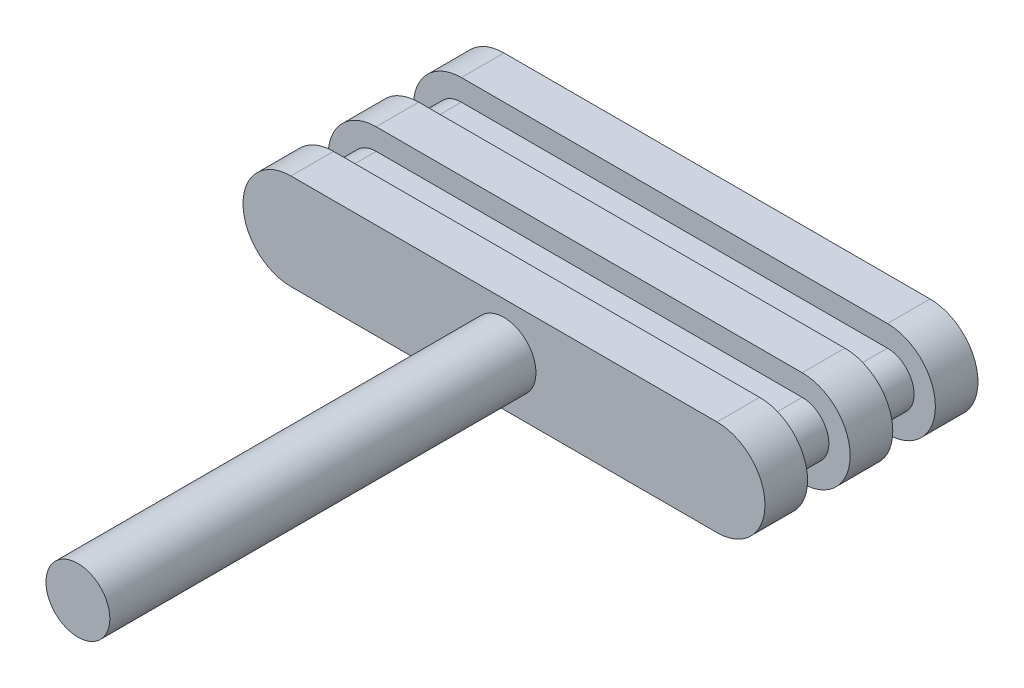
ISO-10303-21;
HEADER;
FILE_DESCRIPTION(('STEP AP214'),'2;1');
FILE_NAME('part.step','',(''),(''),'','','');
FILE_SCHEMA(('AUTOMOTIVE_DESIGN { 1 0 10303 214 1 1 1 1 }'));
ENDSEC;
DATA;
#1=APPLICATION_CONTEXT('core data for automotive mechanical design processes');
#2=APPLICATION_PROTOCOL_DEFINITION('international standard','automotive_design',2000,#1);
#3=PRODUCT_CONTEXT('',#1,'mechanical');
#4=PRODUCT('Part','Part','',(#3));
#5=PRODUCT_RELATED_PRODUCT_CATEGORY('part','',(#4));
#6=PRODUCT_DEFINITION_FORMATION('','',#4);
#7=PRODUCT_DEFINITION_CONTEXT('part definition',#1,'design');
#8=PRODUCT_DEFINITION('design','',#6,#7);
#9=PRODUCT_DEFINITION_SHAPE('','',#8);
#10=(LENGTH_UNIT() NAMED_UNIT(*) SI_UNIT(.MILLI.,.METRE.));
#11=(NAMED_UNIT(*) PLANE_ANGLE_UNIT() SI_UNIT($,.RADIAN.));
#12=(NAMED_UNIT(*) SI_UNIT($,.STERADIAN.) SOLID_ANGLE_UNIT());
#13=UNCERTAINTY_MEASURE_WITH_UNIT(LENGTH_MEASURE(1.E-05),#10,'distance_accuracy_value','');
#14=(GEOMETRIC_REPRESENTATION_CONTEXT(3) GLOBAL_UNCERTAINTY_ASSIGNED_CONTEXT((#13)) GLOBAL_UNIT_ASSIGNED_CONTEXT((#10,
#11,#12)) REPRESENTATION_CONTEXT('',''));
#15=CARTESIAN_POINT('',(0.,0.,0.));
#16=DIRECTION('',(0.,0.,1.));
#17=DIRECTION('',(1.,0.,0.));
#18=AXIS2_PLACEMENT_3D('',#15,#16,#17);
#19=CARTESIAN_POINT('',(0.,-2.25,5.));
#20=DIRECTION('',(0.,1.,0.));
#21=DIRECTION('',(0.,0.,1.));
#22=AXIS2_PLACEMENT_3D('',#19,#20,#21);
#23=PLANE('',#22);
#24=DIRECTION('',(0.,0.,-1.));
#25=VECTOR('',#24,1.);
#26=CARTESIAN_POINT('',(-10.,-2.25,5.));
#27=LINE('',#26,#25);
#28=CARTESIAN_POINT('',(-10.,-2.25,5.));
#29=VERTEX_POINT('',#28);
#30=CARTESIAN_POINT('',(-10.,-2.25,3.));
#31=VERTEX_POINT('',#30);
#32=EDGE_CURVE('E326',#29,#31,#27,.T.);
#33=ORIENTED_EDGE('',*,*,#32,.T.);
#34=DIRECTION('',(1.,0.,0.));
#35=VECTOR('',#34,1.);
#36=CARTESIAN_POINT('',(0.,-2.25,3.));
#37=LINE('',#36,#35);
#38=CARTESIAN_POINT('',(10.,-2.25,3.));
#39=VERTEX_POINT('',#38);
#40=EDGE_CURVE('E294',#31,#39,#37,.T.);
#41=ORIENTED_EDGE('',*,*,#40,.T.);
#42=DIRECTION('',(0.,0.,-1.));
#43=VECTOR('',#42,1.);
#44=CARTESIAN_POINT('',(10.,-2.25,5.));
#45=LINE('',#44,#43);
#46=CARTESIAN_POINT('',(10.,-2.25,5.));
#47=VERTEX_POINT('',#46);
#48=EDGE_CURVE('E13',#47,#39,#45,.T.);
#49=ORIENTED_EDGE('',*,*,#48,.F.);
#50=DIRECTION('',(1.,0.,0.));
#51=VECTOR('',#50,1.);
#52=CARTESIAN_POINT('',(0.,-2.25,5.));
#53=LINE('',#52,#51);
#54=EDGE_CURVE('E305',#29,#47,#53,.T.);
#55=ORIENTED_EDGE('',*,*,#54,.F.);
#56=EDGE_LOOP('',(#33,#41,#49,#55));
#57=FACE_BOUND('',#56,.T.);
#58=ADVANCED_FACE('F51',(#57),#23,.F.);
#59=CARTESIAN_POINT('',(10.,0.,5.));
#60=DIRECTION('',(0.,0.,-1.));
#61=DIRECTION('',(-1.,0.,0.));
#62=AXIS2_PLACEMENT_3D('',#59,#60,#61);
#63=CYLINDRICAL_SURFACE('',#62,2.25);
#64=ORIENTED_EDGE('',*,*,#48,.T.);
#65=CARTESIAN_POINT('',(10.,0.,3.));
#66=DIRECTION('',(0.,0.,1.));
#67=DIRECTION('',(1.,0.,0.));
#68=AXIS2_PLACEMENT_3D('',#65,#66,#67);
#69=CIRCLE('',#68,2.25);
#70=CARTESIAN_POINT('',(10.,2.25,3.));
#71=VERTEX_POINT('',#70);
#72=EDGE_CURVE('E282',#39,#71,#69,.T.);
#73=ORIENTED_EDGE('',*,*,#72,.T.);
#74=DIRECTION('',(0.,0.,-1.));
#75=VECTOR('',#74,1.);
#76=CARTESIAN_POINT('',(10.,2.25,5.));
#77=LINE('',#76,#75);
#78=CARTESIAN_POINT('',(10.,2.25,5.));
#79=VERTEX_POINT('',#78);
#80=EDGE_CURVE('E335',#79,#71,#77,.T.);
#81=ORIENTED_EDGE('',*,*,#80,.F.);
#82=CARTESIAN_POINT('',(10.,0.,5.));
#83=DIRECTION('',(0.,0.,1.));
#84=DIRECTION('',(1.,0.,0.));
#85=AXIS2_PLACEMENT_3D('',#82,#83,#84);
#86=CIRCLE('',#85,2.25);
#87=EDGE_CURVE('E308',#47,#79,#86,.T.);
#88=ORIENTED_EDGE('',*,*,#87,.F.);
#89=EDGE_LOOP('',(#64,#73,#81,#88));
#90=FACE_BOUND('',#89,.T.);
#91=ADVANCED_FACE('F393',(#90),#63,.T.);
#92=CARTESIAN_POINT('',(0.,2.25,5.));
#93=DIRECTION('',(0.,-1.,0.));
#94=DIRECTION('',(0.,0.,-1.));
#95=AXIS2_PLACEMENT_3D('',#92,#93,#94);
#96=PLANE('',#95);
#97=ORIENTED_EDGE('',*,*,#80,.T.);
#98=DIRECTION('',(-1.,0.,0.));
#99=VECTOR('',#98,1.);
#100=CARTESIAN_POINT('',(0.,2.25,3.));
#101=LINE('',#100,#99);
#102=CARTESIAN_POINT('',(-10.,2.25,3.));
#103=VERTEX_POINT('',#102);
#104=EDGE_CURVE('E273',#71,#103,#101,.T.);
#105=ORIENTED_EDGE('',*,*,#104,.T.);
#106=DIRECTION('',(0.,0.,-1.));
#107=VECTOR('',#106,1.);
#108=CARTESIAN_POINT('',(-10.,2.25,5.));
#109=LINE('',#108,#107);
#110=CARTESIAN_POINT('',(-10.,2.25,5.));
#111=VERTEX_POINT('',#110);
#112=EDGE_CURVE('E331',#111,#103,#109,.T.);
#113=ORIENTED_EDGE('',*,*,#112,.F.);
#114=DIRECTION('',(-1.,0.,0.));
#115=VECTOR('',#114,1.);
#116=CARTESIAN_POINT('',(0.,2.25,5.));
#117=LINE('',#116,#115);
#118=EDGE_CURVE('E311',#79,#111,#117,.T.);
#119=ORIENTED_EDGE('',*,*,#118,.F.);
#120=EDGE_LOOP('',(#97,#105,#113,#119));
#121=FACE_BOUND('',#120,.T.);
#122=ADVANCED_FACE('F398',(#121),#96,.F.);
#123=CARTESIAN_POINT('',(-10.,0.,5.));
#124=DIRECTION('',(0.,0.,-1.));
#125=DIRECTION('',(-1.,0.,0.));
#126=AXIS2_PLACEMENT_3D('',#123,#124,#125);
#127=CYLINDRICAL_SURFACE('',#126,2.25);
#128=ORIENTED_EDGE('',*,*,#112,.T.);
#129=CARTESIAN_POINT('',(-10.,0.,3.));
#130=DIRECTION('',(0.,0.,1.));
#131=DIRECTION('',(1.,0.,0.));
#132=AXIS2_PLACEMENT_3D('',#129,#130,#131);
#133=CIRCLE('',#132,2.25);
#134=EDGE_CURVE('E291',#103,#31,#133,.T.);
#135=ORIENTED_EDGE('',*,*,#134,.T.);
#136=ORIENTED_EDGE('',*,*,#32,.F.);
#137=CARTESIAN_POINT('',(-10.,0.,5.));
#138=DIRECTION('',(0.,0.,1.));
#139=DIRECTION('',(1.,0.,0.));
#140=AXIS2_PLACEMENT_3D('',#137,#138,#139);
#141=CIRCLE('',#140,2.25);
#142=EDGE_CURVE('E313',#111,#29,#141,.T.);
#143=ORIENTED_EDGE('',*,*,#142,.F.);
#144=EDGE_LOOP('',(#128,#135,#136,#143));
#145=FACE_BOUND('',#144,.T.);
#146=ADVANCED_FACE('F415',(#145),#127,.T.);
#147=CARTESIAN_POINT('',(0.,0.,5.));
#148=DIRECTION('',(0.,0.,1.));
#149=DIRECTION('',(1.,0.,0.));
#150=AXIS2_PLACEMENT_3D('',#147,#148,#149);
#151=PLANE('',#150);
#152=CARTESIAN_POINT('',(0.,0.,5.));
#153=DIRECTION('',(0.,0.,1.));
#154=DIRECTION('',(1.,0.,0.));
#155=AXIS2_PLACEMENT_3D('',#152,#153,#154);
#156=CIRCLE('',#155,1.5);
#157=CARTESIAN_POINT('',(1.5,0.,5.));
#158=VERTEX_POINT('',#157);
#159=EDGE_CURVE('E288',#158,#158,#156,.T.);
#160=ORIENTED_EDGE('',*,*,#159,.F.);
#161=EDGE_LOOP('',(#160));
#162=FACE_BOUND('',#161,.T.);
#163=ORIENTED_EDGE('',*,*,#54,.T.);
#164=ORIENTED_EDGE('',*,*,#87,.T.);
#165=ORIENTED_EDGE('',*,*,#118,.T.);
#166=ORIENTED_EDGE('',*,*,#142,.T.);
#167=EDGE_LOOP('',(#163,#164,#165,#166));
#168=FACE_BOUND('',#167,.T.);
#169=ADVANCED_FACE('F413',(#162,#168),#151,.T.);
#170=CARTESIAN_POINT('',(0.,0.,25.));
#171=DIRECTION('',(0.,0.,-1.));
#172=DIRECTION('',(-1.,0.,0.));
#173=AXIS2_PLACEMENT_3D('',#170,#171,#172);
#174=CYLINDRICAL_SURFACE('',#173,1.5);
#175=CARTESIAN_POINT('',(0.,0.,25.));
#176=DIRECTION('',(0.,0.,1.));
#177=DIRECTION('',(1.,0.,0.));
#178=AXIS2_PLACEMENT_3D('',#175,#176,#177);
#179=CIRCLE('',#178,1.5);
#180=CARTESIAN_POINT('',(1.5,0.,25.));
#181=VERTEX_POINT('',#180);
#182=EDGE_CURVE('E299',#181,#181,#179,.T.);
#183=ORIENTED_EDGE('',*,*,#182,.F.);
#184=EDGE_LOOP('',(#183));
#185=FACE_BOUND('',#184,.T.);
#186=ORIENTED_EDGE('',*,*,#159,.T.);
#187=EDGE_LOOP('',(#186));
#188=FACE_BOUND('',#187,.T.);
#189=ADVANCED_FACE('F571',(#185,#188),#174,.T.);
#190=CARTESIAN_POINT('',(0.,0.,25.));
#191=DIRECTION('',(0.,0.,1.));
#192=DIRECTION('',(1.,0.,0.));
#193=AXIS2_PLACEMENT_3D('',#190,#191,#192);
#194=PLANE('',#193);
#195=ORIENTED_EDGE('',*,*,#182,.T.);
#196=EDGE_LOOP('',(#195));
#197=FACE_BOUND('',#196,.T.);
#198=ADVANCED_FACE('F561',(#197),#194,.T.);
#199=CARTESIAN_POINT('',(-10.,0.,1.));
#200=DIRECTION('',(0.,0.,1.));
#201=DIRECTION('',(1.,0.,0.));
#202=AXIS2_PLACEMENT_3D('',#199,#200,#201);
#203=PLANE('',#202);
#204=DIRECTION('',(1.,0.,0.));
#205=VECTOR('',#204,1.);
#206=CARTESIAN_POINT('',(-10.,-1.25,1.));
#207=LINE('',#206,#205);
#208=CARTESIAN_POINT('',(-10.,-1.25,1.));
#209=VERTEX_POINT('',#208);
#210=CARTESIAN_POINT('',(10.,-1.25,1.));
#211=VERTEX_POINT('',#210);
#212=EDGE_CURVE('E254',#209,#211,#207,.T.);
#213=ORIENTED_EDGE('',*,*,#212,.F.);
#214=CARTESIAN_POINT('',(-10.,0.,1.));
#215=DIRECTION('',(0.,0.,1.));
#216=DIRECTION('',(1.,0.,0.));
#217=AXIS2_PLACEMENT_3D('',#214,#215,#216);
#218=CIRCLE('',#217,1.25);
#219=CARTESIAN_POINT('',(-10.,1.25,1.));
#220=VERTEX_POINT('',#219);
#221=EDGE_CURVE('E250',#220,#209,#218,.T.);
#222=ORIENTED_EDGE('',*,*,#221,.F.);
#223=DIRECTION('',(-1.,0.,0.));
#224=VECTOR('',#223,1.);
#225=CARTESIAN_POINT('',(10.,1.25,1.));
#226=LINE('',#225,#224);
#227=CARTESIAN_POINT('',(10.,1.25,1.));
#228=VERTEX_POINT('',#227);
#229=EDGE_CURVE('E247',#228,#220,#226,.T.);
#230=ORIENTED_EDGE('',*,*,#229,.F.);
#231=CARTESIAN_POINT('',(10.,0.,1.));
#232=DIRECTION('',(0.,0.,1.));
#233=DIRECTION('',(1.,0.,0.));
#234=AXIS2_PLACEMENT_3D('',#231,#232,#233);
#235=CIRCLE('',#234,1.25);
#236=EDGE_CURVE('E257',#211,#228,#235,.T.);
#237=ORIENTED_EDGE('',*,*,#236,.F.);
#238=EDGE_LOOP('',(#213,#222,#230,#237));
#239=FACE_BOUND('',#238,.T.);
#240=DIRECTION('',(-1.,0.,0.));
#241=VECTOR('',#240,1.);
#242=CARTESIAN_POINT('',(10.,2.25,1.));
#243=LINE('',#242,#241);
#244=CARTESIAN_POINT('',(10.,2.25,1.));
#245=VERTEX_POINT('',#244);
#246=CARTESIAN_POINT('',(-10.,2.25,1.));
#247=VERTEX_POINT('',#246);
#248=EDGE_CURVE('E279',#245,#247,#243,.T.);
#249=ORIENTED_EDGE('',*,*,#248,.T.);
#250=CARTESIAN_POINT('',(-10.,0.,1.));
#251=DIRECTION('',(0.,0.,1.));
#252=DIRECTION('',(1.,0.,0.));
#253=AXIS2_PLACEMENT_3D('',#250,#251,#252);
#254=CIRCLE('',#253,2.25);
#255=CARTESIAN_POINT('',(-10.,-2.25,1.));
#256=VERTEX_POINT('',#255);
#257=EDGE_CURVE('E281',#247,#256,#254,.T.);
#258=ORIENTED_EDGE('',*,*,#257,.T.);
#259=DIRECTION('',(1.,0.,0.));
#260=VECTOR('',#259,1.);
#261=CARTESIAN_POINT('',(-10.,-2.25,1.));
#262=LINE('',#261,#260);
#263=CARTESIAN_POINT('',(10.,-2.25,1.));
#264=VERTEX_POINT('',#263);
#265=EDGE_CURVE('E284',#256,#264,#262,.T.);
#266=ORIENTED_EDGE('',*,*,#265,.T.);
#267=CARTESIAN_POINT('',(10.,0.,1.));
#268=DIRECTION('',(0.,0.,1.));
#269=DIRECTION('',(1.,0.,0.));
#270=AXIS2_PLACEMENT_3D('',#267,#268,#269);
#271=CIRCLE('',#270,2.25);
#272=EDGE_CURVE('E286',#264,#245,#271,.T.);
#273=ORIENTED_EDGE('',*,*,#272,.T.);
#274=EDGE_LOOP('',(#249,#258,#266,#273));
#275=FACE_BOUND('',#274,.T.);
#276=ADVANCED_FACE('F552',(#239,#275),#203,.T.);
#277=CARTESIAN_POINT('',(-10.,0.,3.));
#278=DIRECTION('',(0.,0.,1.));
#279=DIRECTION('',(1.,0.,0.));
#280=AXIS2_PLACEMENT_3D('',#277,#278,#279);
#281=PLANE('',#280);
#282=CARTESIAN_POINT('',(10.,0.,3.));
#283=DIRECTION('',(0.,0.,1.));
#284=DIRECTION('',(1.,0.,0.));
#285=AXIS2_PLACEMENT_3D('',#282,#283,#284);
#286=CIRCLE('',#285,1.25);
#287=CARTESIAN_POINT('',(10.,-1.25,3.));
#288=VERTEX_POINT('',#287);
#289=CARTESIAN_POINT('',(10.,1.25,3.));
#290=VERTEX_POINT('',#289);
#291=EDGE_CURVE('E251',#288,#290,#286,.T.);
#292=ORIENTED_EDGE('',*,*,#291,.T.);
#293=DIRECTION('',(-1.,0.,0.));
#294=VECTOR('',#293,1.);
#295=CARTESIAN_POINT('',(0.,1.25,3.));
#296=LINE('',#295,#294);
#297=CARTESIAN_POINT('',(-10.,1.25,3.));
#298=VERTEX_POINT('',#297);
#299=EDGE_CURVE('E238',#290,#298,#296,.T.);
#300=ORIENTED_EDGE('',*,*,#299,.T.);
#301=CARTESIAN_POINT('',(-10.,0.,3.));
#302=DIRECTION('',(0.,0.,1.));
#303=DIRECTION('',(1.,0.,0.));
#304=AXIS2_PLACEMENT_3D('',#301,#302,#303);
#305=CIRCLE('',#304,1.25);
#306=CARTESIAN_POINT('',(-10.,-1.25,3.));
#307=VERTEX_POINT('',#306);
#308=EDGE_CURVE('E263',#298,#307,#305,.T.);
#309=ORIENTED_EDGE('',*,*,#308,.T.);
#310=DIRECTION('',(1.,0.,0.));
#311=VECTOR('',#310,1.);
#312=CARTESIAN_POINT('',(0.,-1.25,3.));
#313=LINE('',#312,#311);
#314=EDGE_CURVE('E266',#307,#288,#313,.T.);
#315=ORIENTED_EDGE('',*,*,#314,.T.);
#316=EDGE_LOOP('',(#292,#300,#309,#315));
#317=FACE_BOUND('',#316,.T.);
#318=ORIENTED_EDGE('',*,*,#72,.F.);
#319=ORIENTED_EDGE('',*,*,#40,.F.);
#320=ORIENTED_EDGE('',*,*,#134,.F.);
#321=ORIENTED_EDGE('',*,*,#104,.F.);
#322=EDGE_LOOP('',(#318,#319,#320,#321));
#323=FACE_BOUND('',#322,.T.);
#324=ADVANCED_FACE('F543',(#317,#323),#281,.F.);
#325=CARTESIAN_POINT('',(10.,0.,1.));
#326=DIRECTION('',(0.,0.,1.));
#327=DIRECTION('',(1.,0.,0.));
#328=AXIS2_PLACEMENT_3D('',#325,#326,#327);
#329=CYLINDRICAL_SURFACE('',#328,1.25);
#330=ORIENTED_EDGE('',*,*,#291,.F.);
#331=DIRECTION('',(0.,0.,1.));
#332=VECTOR('',#331,1.);
#333=CARTESIAN_POINT('',(10.,-1.25,1.));
#334=LINE('',#333,#332);
#335=EDGE_CURVE('E274',#211,#288,#334,.T.);
#336=ORIENTED_EDGE('',*,*,#335,.F.);
#337=ORIENTED_EDGE('',*,*,#236,.T.);
#338=DIRECTION('',(0.,0.,1.));
#339=VECTOR('',#338,1.);
#340=CARTESIAN_POINT('',(10.,1.25,1.));
#341=LINE('',#340,#339);
#342=EDGE_CURVE('E270',#228,#290,#341,.T.);
#343=ORIENTED_EDGE('',*,*,#342,.T.);
#344=EDGE_LOOP('',(#330,#336,#337,#343));
#345=FACE_BOUND('',#344,.T.);
#346=ADVANCED_FACE('F534',(#345),#329,.T.);
#347=CARTESIAN_POINT('',(0.,-1.25,1.));
#348=DIRECTION('',(0.,-1.,0.));
#349=DIRECTION('',(0.,0.,-1.));
#350=AXIS2_PLACEMENT_3D('',#347,#348,#349);
#351=PLANE('',#350);
#352=ORIENTED_EDGE('',*,*,#314,.F.);
#353=DIRECTION('',(0.,0.,1.));
#354=VECTOR('',#353,1.);
#355=CARTESIAN_POINT('',(-10.,-1.25,1.));
#356=LINE('',#355,#354);
#357=EDGE_CURVE('E276',#209,#307,#356,.T.);
#358=ORIENTED_EDGE('',*,*,#357,.F.);
#359=ORIENTED_EDGE('',*,*,#212,.T.);
#360=ORIENTED_EDGE('',*,*,#335,.T.);
#361=EDGE_LOOP('',(#352,#358,#359,#360));
#362=FACE_BOUND('',#361,.T.);
#363=ADVANCED_FACE('F525',(#362),#351,.T.);
#364=CARTESIAN_POINT('',(-10.,0.,1.));
#365=DIRECTION('',(0.,0.,1.));
#366=DIRECTION('',(1.,0.,0.));
#367=AXIS2_PLACEMENT_3D('',#364,#365,#366);
#368=CYLINDRICAL_SURFACE('',#367,1.25);
#369=ORIENTED_EDGE('',*,*,#308,.F.);
#370=DIRECTION('',(0.,0.,1.));
#371=VECTOR('',#370,1.);
#372=CARTESIAN_POINT('',(-10.,1.25,1.));
#373=LINE('',#372,#371);
#374=EDGE_CURVE('E260',#220,#298,#373,.T.);
#375=ORIENTED_EDGE('',*,*,#374,.F.);
#376=ORIENTED_EDGE('',*,*,#221,.T.);
#377=ORIENTED_EDGE('',*,*,#357,.T.);
#378=EDGE_LOOP('',(#369,#375,#376,#377));
#379=FACE_BOUND('',#378,.T.);
#380=ADVANCED_FACE('F432',(#379),#368,.T.);
#381=CARTESIAN_POINT('',(0.,1.25,1.));
#382=DIRECTION('',(0.,1.,0.));
#383=DIRECTION('',(0.,0.,1.));
#384=AXIS2_PLACEMENT_3D('',#381,#382,#383);
#385=PLANE('',#384);
#386=ORIENTED_EDGE('',*,*,#299,.F.);
#387=ORIENTED_EDGE('',*,*,#342,.F.);
#388=ORIENTED_EDGE('',*,*,#229,.T.);
#389=ORIENTED_EDGE('',*,*,#374,.T.);
#390=EDGE_LOOP('',(#386,#387,#388,#389));
#391=FACE_BOUND('',#390,.T.);
#392=ADVANCED_FACE('F428',(#391),#385,.T.);
#393=CARTESIAN_POINT('',(-10.,2.25,-1.));
#394=VERTEX_POINT('',#393);
#395=EDGE_CURVE('E334',#247,#394,#109,.T.);
#396=ORIENTED_EDGE('',*,*,#395,.T.);
#397=CARTESIAN_POINT('',(-10.,0.,-1.));
#398=DIRECTION('',(0.,0.,1.));
#399=DIRECTION('',(1.,0.,0.));
#400=AXIS2_PLACEMENT_3D('',#397,#398,#399);
#401=CIRCLE('',#400,2.25);
#402=CARTESIAN_POINT('',(-10.,-2.25,-1.));
#403=VERTEX_POINT('',#402);
#404=EDGE_CURVE('E241',#394,#403,#401,.T.);
#405=ORIENTED_EDGE('',*,*,#404,.T.);
#406=EDGE_CURVE('E330',#256,#403,#27,.T.);
#407=ORIENTED_EDGE('',*,*,#406,.F.);
#408=ORIENTED_EDGE('',*,*,#257,.F.);
#409=EDGE_LOOP('',(#396,#405,#407,#408));
#410=FACE_BOUND('',#409,.T.);
#411=ADVANCED_FACE('F364',(#410),#127,.T.);
#412=CARTESIAN_POINT('',(10.,2.25,-1.));
#413=VERTEX_POINT('',#412);
#414=EDGE_CURVE('E337',#245,#413,#77,.T.);
#415=ORIENTED_EDGE('',*,*,#414,.T.);
#416=DIRECTION('',(-1.,0.,0.));
#417=VECTOR('',#416,1.);
#418=CARTESIAN_POINT('',(0.,2.25,-1.));
#419=LINE('',#418,#417);
#420=EDGE_CURVE('E228',#413,#394,#419,.T.);
#421=ORIENTED_EDGE('',*,*,#420,.T.);
#422=ORIENTED_EDGE('',*,*,#395,.F.);
#423=ORIENTED_EDGE('',*,*,#248,.F.);
#424=EDGE_LOOP('',(#415,#421,#422,#423));
#425=FACE_BOUND('',#424,.T.);
#426=ADVANCED_FACE('F369',(#425),#96,.F.);
#427=CARTESIAN_POINT('',(10.,-2.25,-1.));
#428=VERTEX_POINT('',#427);
#429=EDGE_CURVE('E58',#264,#428,#45,.T.);
#430=ORIENTED_EDGE('',*,*,#429,.T.);
#431=CARTESIAN_POINT('',(10.,0.,-1.));
#432=DIRECTION('',(0.,0.,1.));
#433=DIRECTION('',(1.,0.,0.));
#434=AXIS2_PLACEMENT_3D('',#431,#432,#433);
#435=CIRCLE('',#434,2.25);
#436=EDGE_CURVE('E66',#428,#413,#435,.T.);
#437=ORIENTED_EDGE('',*,*,#436,.T.);
#438=ORIENTED_EDGE('',*,*,#414,.F.);
#439=ORIENTED_EDGE('',*,*,#272,.F.);
#440=EDGE_LOOP('',(#430,#437,#438,#439));
#441=FACE_BOUND('',#440,.T.);
#442=ADVANCED_FACE('F374',(#441),#63,.T.);
#443=ORIENTED_EDGE('',*,*,#406,.T.);
#444=DIRECTION('',(1.,0.,0.));
#445=VECTOR('',#444,1.);
#446=CARTESIAN_POINT('',(0.,-2.25,-1.));
#447=LINE('',#446,#445);
#448=EDGE_CURVE('E244',#403,#428,#447,.T.);
#449=ORIENTED_EDGE('',*,*,#448,.T.);
#450=ORIENTED_EDGE('',*,*,#429,.F.);
#451=ORIENTED_EDGE('',*,*,#265,.F.);
#452=EDGE_LOOP('',(#443,#449,#450,#451));
#453=FACE_BOUND('',#452,.T.);
#454=ADVANCED_FACE('F379',(#453),#23,.F.);
#455=CARTESIAN_POINT('',(-10.,0.,-3.));
#456=DIRECTION('',(0.,0.,1.));
#457=DIRECTION('',(1.,0.,0.));
#458=AXIS2_PLACEMENT_3D('',#455,#456,#457);
#459=PLANE('',#458);
#460=DIRECTION('',(1.,0.,0.));
#461=VECTOR('',#460,1.);
#462=CARTESIAN_POINT('',(-10.,-1.25,-3.));
#463=LINE('',#462,#461);
#464=CARTESIAN_POINT('',(-10.,-1.25,-3.));
#465=VERTEX_POINT('',#464);
#466=CARTESIAN_POINT('',(10.,-1.25,-3.));
#467=VERTEX_POINT('',#466);
#468=EDGE_CURVE('E191',#465,#467,#463,.T.);
#469=ORIENTED_EDGE('',*,*,#468,.F.);
#470=CARTESIAN_POINT('',(-10.,0.,-3.));
#471=DIRECTION('',(0.,0.,1.));
#472=DIRECTION('',(1.,0.,0.));
#473=AXIS2_PLACEMENT_3D('',#470,#471,#472);
#474=CIRCLE('',#473,1.25);
#475=CARTESIAN_POINT('',(-10.,1.25,-3.));
#476=VERTEX_POINT('',#475);
#477=EDGE_CURVE('E205',#476,#465,#474,.T.);
#478=ORIENTED_EDGE('',*,*,#477,.F.);
#479=DIRECTION('',(-1.,0.,0.));
#480=VECTOR('',#479,1.);
#481=CARTESIAN_POINT('',(10.,1.25,-3.));
#482=LINE('',#481,#480);
#483=CARTESIAN_POINT('',(10.,1.25,-3.));
#484=VERTEX_POINT('',#483);
#485=EDGE_CURVE('E212',#484,#476,#482,.T.);
#486=ORIENTED_EDGE('',*,*,#485,.F.);
#487=CARTESIAN_POINT('',(10.,0.,-3.));
#488=DIRECTION('',(0.,0.,1.));
#489=DIRECTION('',(1.,0.,0.));
#490=AXIS2_PLACEMENT_3D('',#487,#488,#489);
#491=CIRCLE('',#490,1.25);
#492=EDGE_CURVE('E208',#467,#484,#491,.T.);
#493=ORIENTED_EDGE('',*,*,#492,.F.);
#494=EDGE_LOOP('',(#469,#478,#486,#493));
#495=FACE_BOUND('',#494,.T.);
#496=DIRECTION('',(-1.,0.,0.));
#497=VECTOR('',#496,1.);
#498=CARTESIAN_POINT('',(10.,2.25,-3.));
#499=LINE('',#498,#497);
#500=CARTESIAN_POINT('',(10.,2.25,-3.));
#501=VERTEX_POINT('',#500);
#502=CARTESIAN_POINT('',(-10.,2.25,-3.));
#503=VERTEX_POINT('',#502);
#504=EDGE_CURVE('E231',#501,#503,#499,.T.);
#505=ORIENTED_EDGE('',*,*,#504,.T.);
#506=CARTESIAN_POINT('',(-10.,0.,-3.));
#507=DIRECTION('',(0.,0.,1.));
#508=DIRECTION('',(1.,0.,0.));
#509=AXIS2_PLACEMENT_3D('',#506,#507,#508);
#510=CIRCLE('',#509,2.25);
#511=CARTESIAN_POINT('',(-10.,-2.25,-3.));
#512=VERTEX_POINT('',#511);
#513=EDGE_CURVE('E74',#503,#512,#510,.T.);
#514=ORIENTED_EDGE('',*,*,#513,.T.);
#515=DIRECTION('',(1.,0.,0.));
#516=VECTOR('',#515,1.);
#517=CARTESIAN_POINT('',(-10.,-2.25,-3.));
#518=LINE('',#517,#516);
#519=CARTESIAN_POINT('',(10.,-2.25,-3.));
#520=VERTEX_POINT('',#519);
#521=EDGE_CURVE('E234',#512,#520,#518,.T.);
#522=ORIENTED_EDGE('',*,*,#521,.T.);
#523=CARTESIAN_POINT('',(10.,0.,-3.));
#524=DIRECTION('',(0.,0.,1.));
#525=DIRECTION('',(1.,0.,0.));
#526=AXIS2_PLACEMENT_3D('',#523,#524,#525);
#527=CIRCLE('',#526,2.25);
#528=EDGE_CURVE('E236',#520,#501,#527,.T.);
#529=ORIENTED_EDGE('',*,*,#528,.T.);
#530=EDGE_LOOP('',(#505,#514,#522,#529));
#531=FACE_BOUND('',#530,.T.);
#532=ADVANCED_FACE('F203',(#495,#531),#459,.T.);
#533=CARTESIAN_POINT('',(-10.,0.,-1.));
#534=DIRECTION('',(0.,0.,1.));
#535=DIRECTION('',(1.,0.,0.));
#536=AXIS2_PLACEMENT_3D('',#533,#534,#535);
#537=PLANE('',#536);
#538=CARTESIAN_POINT('',(10.,0.,-1.));
#539=DIRECTION('',(0.,0.,1.));
#540=DIRECTION('',(1.,0.,0.));
#541=AXIS2_PLACEMENT_3D('',#538,#539,#540);
#542=CIRCLE('',#541,1.25);
#543=CARTESIAN_POINT('',(10.,-1.25,-1.));
#544=VERTEX_POINT('',#543);
#545=CARTESIAN_POINT('',(10.,1.25,-1.));
#546=VERTEX_POINT('',#545);
#547=EDGE_CURVE('E214',#544,#546,#542,.T.);
#548=ORIENTED_EDGE('',*,*,#547,.T.);
#549=DIRECTION('',(-1.,0.,0.));
#550=VECTOR('',#549,1.);
#551=CARTESIAN_POINT('',(0.,1.25,-1.));
#552=LINE('',#551,#550);
#553=CARTESIAN_POINT('',(-10.,1.25,-1.));
#554=VERTEX_POINT('',#553);
#555=EDGE_CURVE('E218',#546,#554,#552,.T.);
#556=ORIENTED_EDGE('',*,*,#555,.T.);
#557=CARTESIAN_POINT('',(-10.,0.,-1.));
#558=DIRECTION('',(0.,0.,1.));
#559=DIRECTION('',(1.,0.,0.));
#560=AXIS2_PLACEMENT_3D('',#557,#558,#559);
#561=CIRCLE('',#560,1.25);
#562=CARTESIAN_POINT('',(-10.,-1.25,-1.));
#563=VERTEX_POINT('',#562);
#564=EDGE_CURVE('E221',#554,#563,#561,.T.);
#565=ORIENTED_EDGE('',*,*,#564,.T.);
#566=DIRECTION('',(1.,0.,0.));
#567=VECTOR('',#566,1.);
#568=CARTESIAN_POINT('',(0.,-1.25,-1.));
#569=LINE('',#568,#567);
#570=EDGE_CURVE('E193',#563,#544,#569,.T.);
#571=ORIENTED_EDGE('',*,*,#570,.T.);
#572=EDGE_LOOP('',(#548,#556,#565,#571));
#573=FACE_BOUND('',#572,.T.);
#574=ORIENTED_EDGE('',*,*,#436,.F.);
#575=ORIENTED_EDGE('',*,*,#448,.F.);
#576=ORIENTED_EDGE('',*,*,#404,.F.);
#577=ORIENTED_EDGE('',*,*,#420,.F.);
#578=EDGE_LOOP('',(#574,#575,#576,#577));
#579=FACE_BOUND('',#578,.T.);
#580=ADVANCED_FACE('F371',(#573,#579),#537,.F.);
#581=CARTESIAN_POINT('',(10.,0.,-3.));
#582=DIRECTION('',(0.,0.,1.));
#583=DIRECTION('',(1.,0.,0.));
#584=AXIS2_PLACEMENT_3D('',#581,#582,#583);
#585=CYLINDRICAL_SURFACE('',#584,1.25);
#586=ORIENTED_EDGE('',*,*,#547,.F.);
#587=DIRECTION('',(0.,0.,1.));
#588=VECTOR('',#587,1.);
#589=CARTESIAN_POINT('',(10.,-1.25,-3.));
#590=LINE('',#589,#588);
#591=EDGE_CURVE('E198',#467,#544,#590,.T.);
#592=ORIENTED_EDGE('',*,*,#591,.F.);
#593=ORIENTED_EDGE('',*,*,#492,.T.);
#594=DIRECTION('',(0.,0.,1.));
#595=VECTOR('',#594,1.);
#596=CARTESIAN_POINT('',(10.,1.25,-3.));
#597=LINE('',#596,#595);
#598=EDGE_CURVE('E225',#484,#546,#597,.T.);
#599=ORIENTED_EDGE('',*,*,#598,.T.);
#600=EDGE_LOOP('',(#586,#592,#593,#599));
#601=FACE_BOUND('',#600,.T.);
#602=ADVANCED_FACE('F388',(#601),#585,.T.);
#603=CARTESIAN_POINT('',(0.,-1.25,-3.));
#604=DIRECTION('',(0.,-1.,0.));
#605=DIRECTION('',(0.,0.,-1.));
#606=AXIS2_PLACEMENT_3D('',#603,#604,#605);
#607=PLANE('',#606);
#608=ORIENTED_EDGE('',*,*,#570,.F.);
#609=DIRECTION('',(0.,0.,1.));
#610=VECTOR('',#609,1.);
#611=CARTESIAN_POINT('',(-10.,-1.25,-3.));
#612=LINE('',#611,#610);
#613=EDGE_CURVE('E188',#465,#563,#612,.T.);
#614=ORIENTED_EDGE('',*,*,#613,.F.);
#615=ORIENTED_EDGE('',*,*,#468,.T.);
#616=ORIENTED_EDGE('',*,*,#591,.T.);
#617=EDGE_LOOP('',(#608,#614,#615,#616));
#618=FACE_BOUND('',#617,.T.);
#619=ADVANCED_FACE('F190',(#618),#607,.T.);
#620=CARTESIAN_POINT('',(-10.,0.,-3.));
#621=DIRECTION('',(0.,0.,1.));
#622=DIRECTION('',(1.,0.,0.));
#623=AXIS2_PLACEMENT_3D('',#620,#621,#622);
#624=CYLINDRICAL_SURFACE('',#623,1.25);
#625=ORIENTED_EDGE('',*,*,#564,.F.);
#626=DIRECTION('',(0.,0.,1.));
#627=VECTOR('',#626,1.);
#628=CARTESIAN_POINT('',(-10.,1.25,-3.));
#629=LINE('',#628,#627);
#630=EDGE_CURVE('E199',#476,#554,#629,.T.);
#631=ORIENTED_EDGE('',*,*,#630,.F.);
#632=ORIENTED_EDGE('',*,*,#477,.T.);
#633=ORIENTED_EDGE('',*,*,#613,.T.);
#634=EDGE_LOOP('',(#625,#631,#632,#633));
#635=FACE_BOUND('',#634,.T.);
#636=ADVANCED_FACE('F210',(#635),#624,.T.);
#637=CARTESIAN_POINT('',(0.,1.25,-3.));
#638=DIRECTION('',(0.,1.,0.));
#639=DIRECTION('',(0.,0.,1.));
#640=AXIS2_PLACEMENT_3D('',#637,#638,#639);
#641=PLANE('',#640);
#642=ORIENTED_EDGE('',*,*,#555,.F.);
#643=ORIENTED_EDGE('',*,*,#598,.F.);
#644=ORIENTED_EDGE('',*,*,#485,.T.);
#645=ORIENTED_EDGE('',*,*,#630,.T.);
#646=EDGE_LOOP('',(#642,#643,#644,#645));
#647=FACE_BOUND('',#646,.T.);
#648=ADVANCED_FACE('F405',(#647),#641,.T.);
#649=CARTESIAN_POINT('',(0.,0.,-5.));
#650=DIRECTION('',(0.,0.,1.));
#651=DIRECTION('',(1.,0.,0.));
#652=AXIS2_PLACEMENT_3D('',#649,#650,#651);
#653=PLANE('',#652);
#654=DIRECTION('',(1.,0.,0.));
#655=VECTOR('',#654,1.);
#656=CARTESIAN_POINT('',(0.,-2.25,-5.));
#657=LINE('',#656,#655);
#658=CARTESIAN_POINT('',(-10.,-2.25,-5.));
#659=VERTEX_POINT('',#658);
#660=CARTESIAN_POINT('',(10.,-2.25,-5.));
#661=VERTEX_POINT('',#660);
#662=EDGE_CURVE('E302',#659,#661,#657,.T.);
#663=ORIENTED_EDGE('',*,*,#662,.F.);
#664=CARTESIAN_POINT('',(-10.,0.,-5.));
#665=DIRECTION('',(0.,0.,1.));
#666=DIRECTION('',(1.,0.,0.));
#667=AXIS2_PLACEMENT_3D('',#664,#665,#666);
#668=CIRCLE('',#667,2.25);
#669=CARTESIAN_POINT('',(-10.,2.25,-5.));
#670=VERTEX_POINT('',#669);
#671=EDGE_CURVE('E309',#670,#659,#668,.T.);
#672=ORIENTED_EDGE('',*,*,#671,.F.);
#673=DIRECTION('',(-1.,0.,0.));
#674=VECTOR('',#673,1.);
#675=CARTESIAN_POINT('',(0.,2.25,-5.));
#676=LINE('',#675,#674);
#677=CARTESIAN_POINT('',(10.,2.25,-5.));
#678=VERTEX_POINT('',#677);
#679=EDGE_CURVE('E321',#678,#670,#676,.T.);
#680=ORIENTED_EDGE('',*,*,#679,.F.);
#681=CARTESIAN_POINT('',(10.,0.,-5.));
#682=DIRECTION('',(0.,0.,1.));
#683=DIRECTION('',(1.,0.,0.));
#684=AXIS2_PLACEMENT_3D('',#681,#682,#683);
#685=CIRCLE('',#684,2.25);
#686=EDGE_CURVE('E318',#661,#678,#685,.T.);
#687=ORIENTED_EDGE('',*,*,#686,.F.);
#688=EDGE_LOOP('',(#663,#672,#680,#687));
#689=FACE_BOUND('',#688,.T.);
#690=ADVANCED_FACE('F356',(#689),#653,.F.);
#691=ORIENTED_EDGE('',*,*,#521,.F.);
#692=EDGE_CURVE('E315',#512,#659,#27,.T.);
#693=ORIENTED_EDGE('',*,*,#692,.T.);
#694=ORIENTED_EDGE('',*,*,#662,.T.);
#695=EDGE_CURVE('E59',#520,#661,#45,.T.);
#696=ORIENTED_EDGE('',*,*,#695,.F.);
#697=EDGE_LOOP('',(#691,#693,#694,#696));
#698=FACE_BOUND('',#697,.T.);
#699=ADVANCED_FACE('F381',(#698),#23,.F.);
#700=ORIENTED_EDGE('',*,*,#528,.F.);
#701=ORIENTED_EDGE('',*,*,#695,.T.);
#702=ORIENTED_EDGE('',*,*,#686,.T.);
#703=EDGE_CURVE('E333',#501,#678,#77,.T.);
#704=ORIENTED_EDGE('',*,*,#703,.F.);
#705=EDGE_LOOP('',(#700,#701,#702,#704));
#706=FACE_BOUND('',#705,.T.);
#707=ADVANCED_FACE('F352',(#706),#63,.T.);
#708=ORIENTED_EDGE('',*,*,#504,.F.);
#709=ORIENTED_EDGE('',*,*,#703,.T.);
#710=ORIENTED_EDGE('',*,*,#679,.T.);
#711=EDGE_CURVE('E329',#503,#670,#109,.T.);
#712=ORIENTED_EDGE('',*,*,#711,.F.);
#713=EDGE_LOOP('',(#708,#709,#710,#712));
#714=FACE_BOUND('',#713,.T.);
#715=ADVANCED_FACE('F345',(#714),#96,.F.);
#716=ORIENTED_EDGE('',*,*,#513,.F.);
#717=ORIENTED_EDGE('',*,*,#711,.T.);
#718=ORIENTED_EDGE('',*,*,#671,.T.);
#719=ORIENTED_EDGE('',*,*,#692,.F.);
#720=EDGE_LOOP('',(#716,#717,#718,#719));
#721=FACE_BOUND('',#720,.T.);
#722=ADVANCED_FACE('F359',(#721),#127,.T.);
#723=CLOSED_SHELL('',(#58,#91,#122,#146,#169,#189,#198,#276,#324,#346,#363,#380,#392,#411,#426,
#442,#454,#532,#580,#602,#619,#636,#648,#690,#699,#707,#715,#722));
#724=MANIFOLD_SOLID_BREP('B2',#723);
#725=ADVANCED_BREP_SHAPE_REPRESENTATION('',(#18,#724),#14);
#726=SHAPE_DEFINITION_REPRESENTATION(#9,#725);
ENDSEC;
END-ISO-10303-21;
